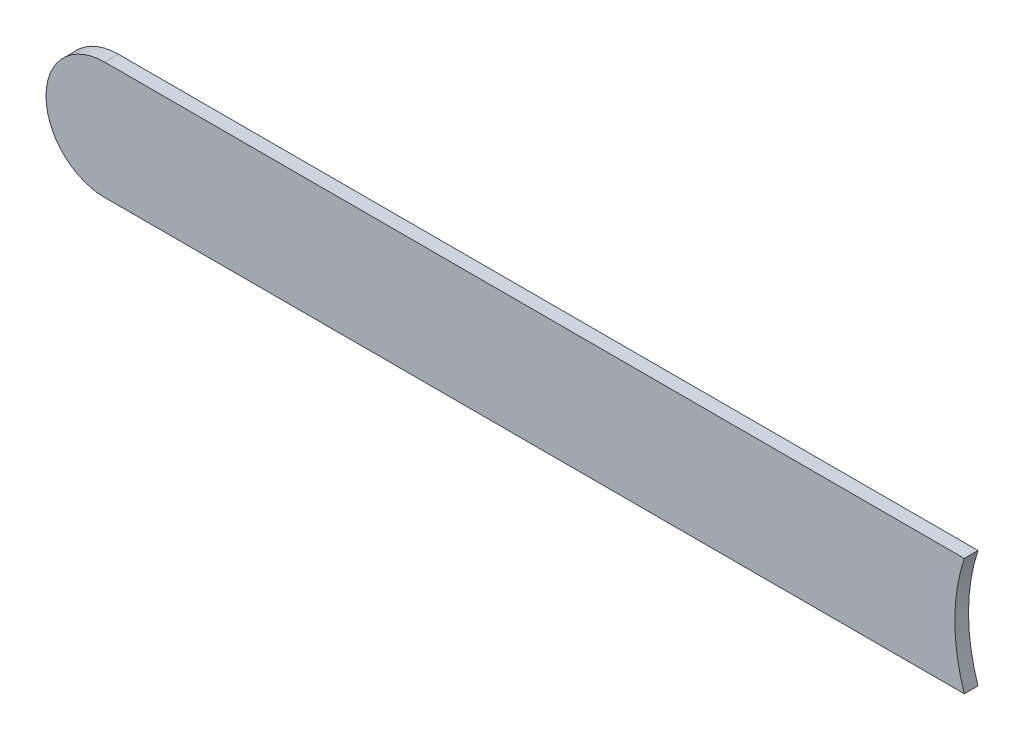
ISO-10303-21;
HEADER;
FILE_DESCRIPTION(('STEP AP214'),'2;1');
FILE_NAME('part.step','',(''),(''),'','','');
FILE_SCHEMA(('AUTOMOTIVE_DESIGN { 1 0 10303 214 1 1 1 1 }'));
ENDSEC;
DATA;
#1=APPLICATION_CONTEXT('core data for automotive mechanical design processes');
#2=APPLICATION_PROTOCOL_DEFINITION('international standard','automotive_design',2000,#1);
#3=PRODUCT_CONTEXT('',#1,'mechanical');
#4=PRODUCT('Part','Part','',(#3));
#5=PRODUCT_RELATED_PRODUCT_CATEGORY('part','',(#4));
#6=PRODUCT_DEFINITION_FORMATION('','',#4);
#7=PRODUCT_DEFINITION_CONTEXT('part definition',#1,'design');
#8=PRODUCT_DEFINITION('design','',#6,#7);
#9=PRODUCT_DEFINITION_SHAPE('','',#8);
#10=(LENGTH_UNIT() NAMED_UNIT(*) SI_UNIT(.MILLI.,.METRE.));
#11=(NAMED_UNIT(*) PLANE_ANGLE_UNIT() SI_UNIT($,.RADIAN.));
#12=(NAMED_UNIT(*) SI_UNIT($,.STERADIAN.) SOLID_ANGLE_UNIT());
#13=UNCERTAINTY_MEASURE_WITH_UNIT(LENGTH_MEASURE(1.E-05),#10,'distance_accuracy_value','');
#14=(GEOMETRIC_REPRESENTATION_CONTEXT(3) GLOBAL_UNCERTAINTY_ASSIGNED_CONTEXT((#13)) GLOBAL_UNIT_ASSIGNED_CONTEXT((#10,
#11,#12)) REPRESENTATION_CONTEXT('',''));
#15=CARTESIAN_POINT('',(0.,0.,0.));
#16=DIRECTION('',(0.,0.,1.));
#17=DIRECTION('',(1.,0.,0.));
#18=AXIS2_PLACEMENT_3D('',#15,#16,#17);
#19=CARTESIAN_POINT('',(78.725,-121.925,1.6));
#20=DIRECTION('',(0.,-1.,0.));
#21=DIRECTION('',(0.,0.,-1.));
#22=AXIS2_PLACEMENT_3D('',#19,#20,#21);
#23=PLANE('',#22);
#24=DIRECTION('',(0.,0.,1.));
#25=VECTOR('',#24,1.);
#26=CARTESIAN_POINT('',(76.075,-121.925,1.6));
#27=LINE('',#26,#25);
#28=CARTESIAN_POINT('',(76.075,-121.925,1.6));
#29=VERTEX_POINT('',#28);
#30=CARTESIAN_POINT('',(76.075,-121.925,1.635));
#31=VERTEX_POINT('',#30);
#32=EDGE_CURVE('E11',#29,#31,#27,.T.);
#33=ORIENTED_EDGE('',*,*,#32,.T.);
#34=DIRECTION('',(-1.,0.,0.));
#35=VECTOR('',#34,1.);
#36=CARTESIAN_POINT('',(78.725,-121.925,1.635));
#37=LINE('',#36,#35);
#38=CARTESIAN_POINT('',(78.274306090567,-121.925,1.635));
#39=VERTEX_POINT('',#38);
#40=EDGE_CURVE('E20',#39,#31,#37,.T.);
#41=ORIENTED_EDGE('',*,*,#40,.F.);
#42=DIRECTION('',(0.,0.,-1.));
#43=VECTOR('',#42,1.);
#44=CARTESIAN_POINT('',(78.274306090567,-121.925,-0.045));
#45=LINE('',#44,#43);
#46=CARTESIAN_POINT('',(78.274306090567,-121.925,1.6));
#47=VERTEX_POINT('',#46);
#48=EDGE_CURVE('E74',#39,#47,#45,.T.);
#49=ORIENTED_EDGE('',*,*,#48,.T.);
#50=DIRECTION('',(-1.,0.,0.));
#51=VECTOR('',#50,1.);
#52=CARTESIAN_POINT('',(78.725,-121.925,1.6));
#53=LINE('',#52,#51);
#54=EDGE_CURVE('E104',#47,#29,#53,.T.);
#55=ORIENTED_EDGE('',*,*,#54,.T.);
#56=EDGE_LOOP('',(#33,#41,#49,#55));
#57=FACE_BOUND('',#56,.T.);
#58=ADVANCED_FACE('F17',(#57),#23,.F.);
#59=CARTESIAN_POINT('',(76.075,-122.075,1.6));
#60=DIRECTION('',(0.,0.,-1.));
#61=DIRECTION('',(0.,1.,0.));
#62=AXIS2_PLACEMENT_3D('',#59,#60,#61);
#63=CYLINDRICAL_SURFACE('',#62,0.15);
#64=CARTESIAN_POINT('',(76.075,-122.075,1.6));
#65=DIRECTION('',(0.,0.,1.));
#66=DIRECTION('',(0.,1.,0.));
#67=AXIS2_PLACEMENT_3D('',#64,#65,#66);
#68=CIRCLE('',#67,0.15);
#69=CARTESIAN_POINT('',(76.075,-122.225,1.6));
#70=VERTEX_POINT('',#69);
#71=EDGE_CURVE('E77',#29,#70,#68,.T.);
#72=ORIENTED_EDGE('',*,*,#71,.T.);
#73=DIRECTION('',(0.,0.,1.));
#74=VECTOR('',#73,1.);
#75=CARTESIAN_POINT('',(76.075,-122.225,1.6));
#76=LINE('',#75,#74);
#77=CARTESIAN_POINT('',(76.075,-122.225,1.635));
#78=VERTEX_POINT('',#77);
#79=EDGE_CURVE('E88',#70,#78,#76,.T.);
#80=ORIENTED_EDGE('',*,*,#79,.T.);
#81=CARTESIAN_POINT('',(76.075,-122.075,1.635));
#82=DIRECTION('',(0.,0.,1.));
#83=DIRECTION('',(0.,1.,0.));
#84=AXIS2_PLACEMENT_3D('',#81,#82,#83);
#85=CIRCLE('',#84,0.15);
#86=EDGE_CURVE('E83',#31,#78,#85,.T.);
#87=ORIENTED_EDGE('',*,*,#86,.F.);
#88=ORIENTED_EDGE('',*,*,#32,.F.);
#89=EDGE_LOOP('',(#72,#80,#87,#88));
#90=FACE_BOUND('',#89,.T.);
#91=ADVANCED_FACE('F121',(#90),#63,.T.);
#92=CARTESIAN_POINT('',(76.075,-122.225,1.635));
#93=DIRECTION('',(0.,0.,1.));
#94=DIRECTION('',(1.,0.,0.));
#95=AXIS2_PLACEMENT_3D('',#92,#93,#94);
#96=PLANE('',#95);
#97=ORIENTED_EDGE('',*,*,#86,.T.);
#98=DIRECTION('',(1.,0.,0.));
#99=VECTOR('',#98,1.);
#100=CARTESIAN_POINT('',(76.075,-122.225,1.635));
#101=LINE('',#100,#99);
#102=CARTESIAN_POINT('',(78.274306090566,-122.225,1.635));
#103=VERTEX_POINT('',#102);
#104=EDGE_CURVE('E80',#78,#103,#101,.T.);
#105=ORIENTED_EDGE('',*,*,#104,.T.);
#106=CARTESIAN_POINT('',(78.725,-122.075,1.635));
#107=DIRECTION('',(0.,0.,-1.));
#108=DIRECTION('',(0.,-1.,0.));
#109=AXIS2_PLACEMENT_3D('',#106,#107,#108);
#110=CIRCLE('',#109,0.475);
#111=EDGE_CURVE('E68',#103,#39,#110,.T.);
#112=ORIENTED_EDGE('',*,*,#111,.T.);
#113=ORIENTED_EDGE('',*,*,#40,.T.);
#114=EDGE_LOOP('',(#97,#105,#112,#113));
#115=FACE_BOUND('',#114,.T.);
#116=ADVANCED_FACE('F81',(#115),#96,.T.);
#117=CARTESIAN_POINT('',(78.725,-122.075,-0.045));
#118=DIRECTION('',(0.,0.,-1.));
#119=DIRECTION('',(0.,-1.,0.));
#120=AXIS2_PLACEMENT_3D('',#117,#118,#119);
#121=CYLINDRICAL_SURFACE('',#120,0.475);
#122=ORIENTED_EDGE('',*,*,#111,.F.);
#123=DIRECTION('',(0.,0.,-1.));
#124=VECTOR('',#123,1.);
#125=CARTESIAN_POINT('',(78.274306090567,-122.225,-0.045));
#126=LINE('',#125,#124);
#127=CARTESIAN_POINT('',(78.274306090566,-122.225,1.6));
#128=VERTEX_POINT('',#127);
#129=EDGE_CURVE('E73',#103,#128,#126,.T.);
#130=ORIENTED_EDGE('',*,*,#129,.T.);
#131=CARTESIAN_POINT('',(78.725,-122.075,1.6));
#132=DIRECTION('',(0.,0.,-1.));
#133=DIRECTION('',(0.,-1.,0.));
#134=AXIS2_PLACEMENT_3D('',#131,#132,#133);
#135=CIRCLE('',#134,0.475);
#136=EDGE_CURVE('E107',#128,#47,#135,.T.);
#137=ORIENTED_EDGE('',*,*,#136,.T.);
#138=ORIENTED_EDGE('',*,*,#48,.F.);
#139=EDGE_LOOP('',(#122,#130,#137,#138));
#140=FACE_BOUND('',#139,.T.);
#141=ADVANCED_FACE('F70',(#140),#121,.F.);
#142=CARTESIAN_POINT('',(76.075,-122.225,1.6));
#143=DIRECTION('',(0.,0.,1.));
#144=DIRECTION('',(1.,0.,0.));
#145=AXIS2_PLACEMENT_3D('',#142,#143,#144);
#146=PLANE('',#145);
#147=ORIENTED_EDGE('',*,*,#54,.F.);
#148=ORIENTED_EDGE('',*,*,#136,.F.);
#149=DIRECTION('',(1.,0.,0.));
#150=VECTOR('',#149,1.);
#151=CARTESIAN_POINT('',(76.075,-122.225,1.6));
#152=LINE('',#151,#150);
#153=EDGE_CURVE('E93',#70,#128,#152,.T.);
#154=ORIENTED_EDGE('',*,*,#153,.F.);
#155=ORIENTED_EDGE('',*,*,#71,.F.);
#156=EDGE_LOOP('',(#147,#148,#154,#155));
#157=FACE_BOUND('',#156,.T.);
#158=ADVANCED_FACE('F119',(#157),#146,.F.);
#159=CARTESIAN_POINT('',(76.075,-122.225,1.6));
#160=DIRECTION('',(0.,1.,0.));
#161=DIRECTION('',(1.,0.,0.));
#162=AXIS2_PLACEMENT_3D('',#159,#160,#161);
#163=PLANE('',#162);
#164=ORIENTED_EDGE('',*,*,#129,.F.);
#165=ORIENTED_EDGE('',*,*,#104,.F.);
#166=ORIENTED_EDGE('',*,*,#79,.F.);
#167=ORIENTED_EDGE('',*,*,#153,.T.);
#168=EDGE_LOOP('',(#164,#165,#166,#167));
#169=FACE_BOUND('',#168,.T.);
#170=ADVANCED_FACE('F91',(#169),#163,.F.);
#171=CLOSED_SHELL('',(#58,#91,#116,#141,#158,#170));
#172=MANIFOLD_SOLID_BREP('B1',#171);
#173=ADVANCED_BREP_SHAPE_REPRESENTATION('',(#18,#172),#14);
#174=SHAPE_DEFINITION_REPRESENTATION(#9,#173);
ENDSEC;
END-ISO-10303-21;
